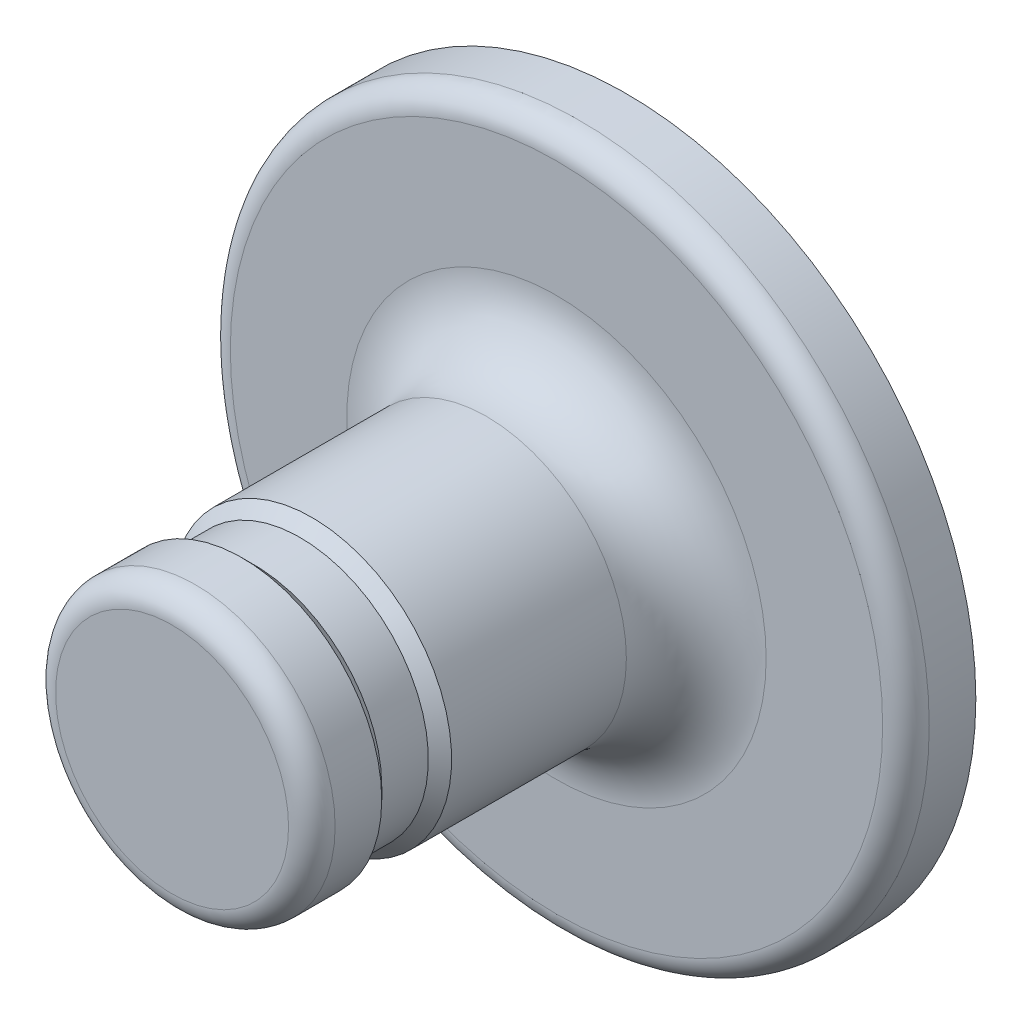
ISO-10303-21;
HEADER;
FILE_DESCRIPTION(('STEP AP214'),'2;1');
FILE_NAME('part.step','',(''),(''),'','','');
FILE_SCHEMA(('AUTOMOTIVE_DESIGN { 1 0 10303 214 1 1 1 1 }'));
ENDSEC;
DATA;
#1=APPLICATION_CONTEXT('core data for automotive mechanical design processes');
#2=APPLICATION_PROTOCOL_DEFINITION('international standard','automotive_design',2000,#1);
#3=PRODUCT_CONTEXT('',#1,'mechanical');
#4=PRODUCT('Part','Part','',(#3));
#5=PRODUCT_RELATED_PRODUCT_CATEGORY('part','',(#4));
#6=PRODUCT_DEFINITION_FORMATION('','',#4);
#7=PRODUCT_DEFINITION_CONTEXT('part definition',#1,'design');
#8=PRODUCT_DEFINITION('design','',#6,#7);
#9=PRODUCT_DEFINITION_SHAPE('','',#8);
#10=(LENGTH_UNIT() NAMED_UNIT(*) SI_UNIT(.MILLI.,.METRE.));
#11=(NAMED_UNIT(*) PLANE_ANGLE_UNIT() SI_UNIT($,.RADIAN.));
#12=(NAMED_UNIT(*) SI_UNIT($,.STERADIAN.) SOLID_ANGLE_UNIT());
#13=UNCERTAINTY_MEASURE_WITH_UNIT(LENGTH_MEASURE(1.E-05),#10,'distance_accuracy_value','');
#14=(GEOMETRIC_REPRESENTATION_CONTEXT(3) GLOBAL_UNCERTAINTY_ASSIGNED_CONTEXT((#13)) GLOBAL_UNIT_ASSIGNED_CONTEXT((#10,
#11,#12)) REPRESENTATION_CONTEXT('',''));
#15=CARTESIAN_POINT('',(0.,0.,0.));
#16=DIRECTION('',(0.,0.,1.));
#17=DIRECTION('',(1.,0.,0.));
#18=AXIS2_PLACEMENT_3D('',#15,#16,#17);
#19=CARTESIAN_POINT('',(0.,0.,3.));
#20=DIRECTION('',(0.,0.,-1.));
#21=DIRECTION('',(-1.,0.,0.));
#22=AXIS2_PLACEMENT_3D('',#19,#20,#21);
#23=CYLINDRICAL_SURFACE('',#22,15.);
#24=CARTESIAN_POINT('',(0.,0.,2.));
#25=DIRECTION('',(0.,0.,1.));
#26=DIRECTION('',(1.,0.,0.));
#27=AXIS2_PLACEMENT_3D('',#24,#25,#26);
#28=CIRCLE('',#27,15.);
#29=CARTESIAN_POINT('',(15.,0.,2.));
#30=VERTEX_POINT('',#29);
#31=EDGE_CURVE('E62',#30,#30,#28,.F.);
#32=ORIENTED_EDGE('',*,*,#31,.T.);
#33=EDGE_LOOP('',(#32));
#34=FACE_BOUND('',#33,.T.);
#35=CARTESIAN_POINT('',(0.,0.,0.));
#36=DIRECTION('',(0.,0.,1.));
#37=DIRECTION('',(1.,0.,0.));
#38=AXIS2_PLACEMENT_3D('',#35,#36,#37);
#39=CIRCLE('',#38,15.);
#40=CARTESIAN_POINT('',(15.,0.,0.));
#41=VERTEX_POINT('',#40);
#42=EDGE_CURVE('E74',#41,#41,#39,.T.);
#43=ORIENTED_EDGE('',*,*,#42,.T.);
#44=EDGE_LOOP('',(#43));
#45=FACE_BOUND('',#44,.T.);
#46=ADVANCED_FACE('F35',(#34,#45),#23,.T.);
#47=CARTESIAN_POINT('',(0.,0.,3.));
#48=DIRECTION('',(0.,0.,1.));
#49=DIRECTION('',(1.,0.,0.));
#50=AXIS2_PLACEMENT_3D('',#47,#48,#49);
#51=PLANE('',#50);
#52=CARTESIAN_POINT('',(0.,0.,3.));
#53=DIRECTION('',(0.,0.,1.));
#54=DIRECTION('',(1.,0.,0.));
#55=AXIS2_PLACEMENT_3D('',#52,#53,#54);
#56=CIRCLE('',#55,14.);
#57=CARTESIAN_POINT('',(14.,0.,3.));
#58=VERTEX_POINT('',#57);
#59=EDGE_CURVE('E65',#58,#58,#56,.T.);
#60=ORIENTED_EDGE('',*,*,#59,.T.);
#61=EDGE_LOOP('',(#60));
#62=FACE_BOUND('',#61,.T.);
#63=CARTESIAN_POINT('',(0.,0.,3.));
#64=DIRECTION('',(0.,0.,1.));
#65=DIRECTION('',(1.,0.,0.));
#66=AXIS2_PLACEMENT_3D('',#63,#64,#65);
#67=CIRCLE('',#66,9.);
#68=CARTESIAN_POINT('',(9.,0.,3.));
#69=VERTEX_POINT('',#68);
#70=EDGE_CURVE('E68',#69,#69,#67,.F.);
#71=ORIENTED_EDGE('',*,*,#70,.T.);
#72=EDGE_LOOP('',(#71));
#73=FACE_BOUND('',#72,.T.);
#74=ADVANCED_FACE('F82',(#62,#73),#51,.T.);
#75=CARTESIAN_POINT('',(0.,0.,0.));
#76=DIRECTION('',(0.,0.,1.));
#77=DIRECTION('',(1.,0.,0.));
#78=AXIS2_PLACEMENT_3D('',#75,#76,#77);
#79=PLANE('',#78);
#80=ORIENTED_EDGE('',*,*,#42,.F.);
#81=EDGE_LOOP('',(#80));
#82=FACE_BOUND('',#81,.T.);
#83=ADVANCED_FACE('F79',(#82),#79,.F.);
#84=CARTESIAN_POINT('',(0.,0.,19.5));
#85=DIRECTION('',(0.,0.,-1.));
#86=DIRECTION('',(-1.,0.,0.));
#87=AXIS2_PLACEMENT_3D('',#84,#85,#86);
#88=CYLINDRICAL_SURFACE('',#87,6.);
#89=CARTESIAN_POINT('',(0.,0.,13.5));
#90=DIRECTION('',(0.,0.,-1.));
#91=DIRECTION('',(-1.,0.,0.));
#92=AXIS2_PLACEMENT_3D('',#89,#90,#91);
#93=CIRCLE('',#92,6.);
#94=CARTESIAN_POINT('',(-6.,0.,13.5));
#95=VERTEX_POINT('',#94);
#96=EDGE_CURVE('E43',#95,#95,#93,.T.);
#97=ORIENTED_EDGE('',*,*,#96,.T.);
#98=EDGE_LOOP('',(#97));
#99=FACE_BOUND('',#98,.T.);
#100=CARTESIAN_POINT('',(0.,0.,6.));
#101=DIRECTION('',(0.,0.,1.));
#102=DIRECTION('',(1.,0.,0.));
#103=AXIS2_PLACEMENT_3D('',#100,#101,#102);
#104=CIRCLE('',#103,6.);
#105=CARTESIAN_POINT('',(6.,0.,6.));
#106=VERTEX_POINT('',#105);
#107=EDGE_CURVE('E71',#106,#106,#104,.T.);
#108=ORIENTED_EDGE('',*,*,#107,.T.);
#109=EDGE_LOOP('',(#108));
#110=FACE_BOUND('',#109,.T.);
#111=ADVANCED_FACE('F81',(#99,#110),#88,.T.);
#112=CARTESIAN_POINT('',(0.,0.,6.));
#113=DIRECTION('',(0.,0.,1.));
#114=DIRECTION('',(1.,0.,0.));
#115=AXIS2_PLACEMENT_3D('',#112,#113,#114);
#116=TOROIDAL_SURFACE('',#115,9.,3.);
#117=ORIENTED_EDGE('',*,*,#70,.F.);
#118=EDGE_LOOP('',(#117));
#119=FACE_BOUND('',#118,.T.);
#120=ORIENTED_EDGE('',*,*,#107,.F.);
#121=EDGE_LOOP('',(#120));
#122=FACE_BOUND('',#121,.T.);
#123=ADVANCED_FACE('F88',(#119,#122),#116,.F.);
#124=CARTESIAN_POINT('',(0.,0.,2.));
#125=DIRECTION('',(0.,0.,1.));
#126=DIRECTION('',(1.,0.,0.));
#127=AXIS2_PLACEMENT_3D('',#124,#125,#126);
#128=TOROIDAL_SURFACE('',#127,14.,1.);
#129=ORIENTED_EDGE('',*,*,#31,.F.);
#130=EDGE_LOOP('',(#129));
#131=FACE_BOUND('',#130,.T.);
#132=ORIENTED_EDGE('',*,*,#59,.F.);
#133=EDGE_LOOP('',(#132));
#134=FACE_BOUND('',#133,.T.);
#135=ADVANCED_FACE('F101',(#131,#134),#128,.T.);
#136=CARTESIAN_POINT('',(0.,0.,17.));
#137=DIRECTION('',(0.,0.,-1.));
#138=DIRECTION('',(-1.,0.,0.));
#139=AXIS2_PLACEMENT_3D('',#136,#137,#138);
#140=CYLINDRICAL_SURFACE('',#139,5.5);
#141=CARTESIAN_POINT('',(0.,0.,14.));
#142=DIRECTION('',(0.,0.,-1.));
#143=DIRECTION('',(-1.,0.,0.));
#144=AXIS2_PLACEMENT_3D('',#141,#142,#143);
#145=CIRCLE('',#144,5.5);
#146=CARTESIAN_POINT('',(-5.5,0.,14.));
#147=VERTEX_POINT('',#146);
#148=EDGE_CURVE('E47',#147,#147,#145,.F.);
#149=ORIENTED_EDGE('',*,*,#148,.T.);
#150=EDGE_LOOP('',(#149));
#151=FACE_BOUND('',#150,.T.);
#152=CARTESIAN_POINT('',(0.,0.,16.));
#153=DIRECTION('',(0.,0.,-1.));
#154=DIRECTION('',(-1.,0.,0.));
#155=AXIS2_PLACEMENT_3D('',#152,#153,#154);
#156=CIRCLE('',#155,5.5);
#157=CARTESIAN_POINT('',(-5.5,0.,16.));
#158=VERTEX_POINT('',#157);
#159=EDGE_CURVE('E51',#158,#158,#156,.T.);
#160=ORIENTED_EDGE('',*,*,#159,.T.);
#161=EDGE_LOOP('',(#160));
#162=FACE_BOUND('',#161,.T.);
#163=ADVANCED_FACE('F105',(#151,#162),#140,.T.);
#164=CARTESIAN_POINT('',(0.,0.,19.5));
#165=DIRECTION('',(0.,0.,1.));
#166=DIRECTION('',(1.,0.,0.));
#167=AXIS2_PLACEMENT_3D('',#164,#165,#166);
#168=PLANE('',#167);
#169=CARTESIAN_POINT('',(0.,0.,19.5));
#170=DIRECTION('',(0.,0.,1.));
#171=DIRECTION('',(1.,0.,0.));
#172=AXIS2_PLACEMENT_3D('',#169,#170,#171);
#173=CIRCLE('',#172,5.);
#174=CARTESIAN_POINT('',(5.,0.,19.5));
#175=VERTEX_POINT('',#174);
#176=EDGE_CURVE('E59',#175,#175,#173,.T.);
#177=ORIENTED_EDGE('',*,*,#176,.T.);
#178=EDGE_LOOP('',(#177));
#179=FACE_BOUND('',#178,.T.);
#180=ADVANCED_FACE('F109',(#179),#168,.T.);
#181=CARTESIAN_POINT('',(0.,0.,18.5));
#182=DIRECTION('',(0.,0.,1.));
#183=DIRECTION('',(1.,0.,0.));
#184=AXIS2_PLACEMENT_3D('',#181,#182,#183);
#185=TOROIDAL_SURFACE('',#184,5.,1.);
#186=CARTESIAN_POINT('',(0.,0.,18.5));
#187=DIRECTION('',(0.,0.,1.));
#188=DIRECTION('',(1.,0.,0.));
#189=AXIS2_PLACEMENT_3D('',#186,#187,#188);
#190=CIRCLE('',#189,6.);
#191=CARTESIAN_POINT('',(6.,0.,18.5));
#192=VERTEX_POINT('',#191);
#193=EDGE_CURVE('E56',#192,#192,#190,.F.);
#194=ORIENTED_EDGE('',*,*,#193,.F.);
#195=EDGE_LOOP('',(#194));
#196=FACE_BOUND('',#195,.T.);
#197=ORIENTED_EDGE('',*,*,#176,.F.);
#198=EDGE_LOOP('',(#197));
#199=FACE_BOUND('',#198,.T.);
#200=ADVANCED_FACE('F107',(#196,#199),#185,.T.);
#201=CARTESIAN_POINT('',(0.,0.,16.5));
#202=DIRECTION('',(0.,0.,1.));
#203=DIRECTION('',(1.,0.,0.));
#204=AXIS2_PLACEMENT_3D('',#201,#202,#203);
#205=CIRCLE('',#204,6.);
#206=CARTESIAN_POINT('',(6.,0.,16.5));
#207=VERTEX_POINT('',#206);
#208=EDGE_CURVE('E10',#207,#207,#205,.T.);
#209=ORIENTED_EDGE('',*,*,#208,.T.);
#210=EDGE_LOOP('',(#209));
#211=FACE_BOUND('',#210,.T.);
#212=ORIENTED_EDGE('',*,*,#193,.T.);
#213=EDGE_LOOP('',(#212));
#214=FACE_BOUND('',#213,.T.);
#215=ADVANCED_FACE('F90',(#211,#214),#88,.T.);
#216=CARTESIAN_POINT('',(0.,0.,13.));
#217=DIRECTION('',(0.,0.,-1.));
#218=DIRECTION('',(-1.,0.,0.));
#219=AXIS2_PLACEMENT_3D('',#216,#217,#218);
#220=CONICAL_SURFACE('',#219,6.50000000000002,0.785398163397453);
#221=ORIENTED_EDGE('',*,*,#148,.F.);
#222=EDGE_LOOP('',(#221));
#223=FACE_BOUND('',#222,.T.);
#224=ORIENTED_EDGE('',*,*,#96,.F.);
#225=EDGE_LOOP('',(#224));
#226=FACE_BOUND('',#225,.T.);
#227=ADVANCED_FACE('F112',(#223,#226),#220,.T.);
#228=CARTESIAN_POINT('',(0.,0.,16.));
#229=DIRECTION('',(0.,0.,1.));
#230=DIRECTION('',(1.,0.,0.));
#231=AXIS2_PLACEMENT_3D('',#228,#229,#230);
#232=CONICAL_SURFACE('',#231,5.5,0.785398163397443);
#233=ORIENTED_EDGE('',*,*,#208,.F.);
#234=EDGE_LOOP('',(#233));
#235=FACE_BOUND('',#234,.T.);
#236=ORIENTED_EDGE('',*,*,#159,.F.);
#237=EDGE_LOOP('',(#236));
#238=FACE_BOUND('',#237,.T.);
#239=ADVANCED_FACE('F38',(#235,#238),#232,.T.);
#240=CLOSED_SHELL('',(#46,#74,#83,#111,#123,#135,#163,#180,#200,#215,#227,#239));
#241=MANIFOLD_SOLID_BREP('B2',#240);
#242=ADVANCED_BREP_SHAPE_REPRESENTATION('',(#18,#241),#14);
#243=SHAPE_DEFINITION_REPRESENTATION(#9,#242);
ENDSEC;
END-ISO-10303-21;
